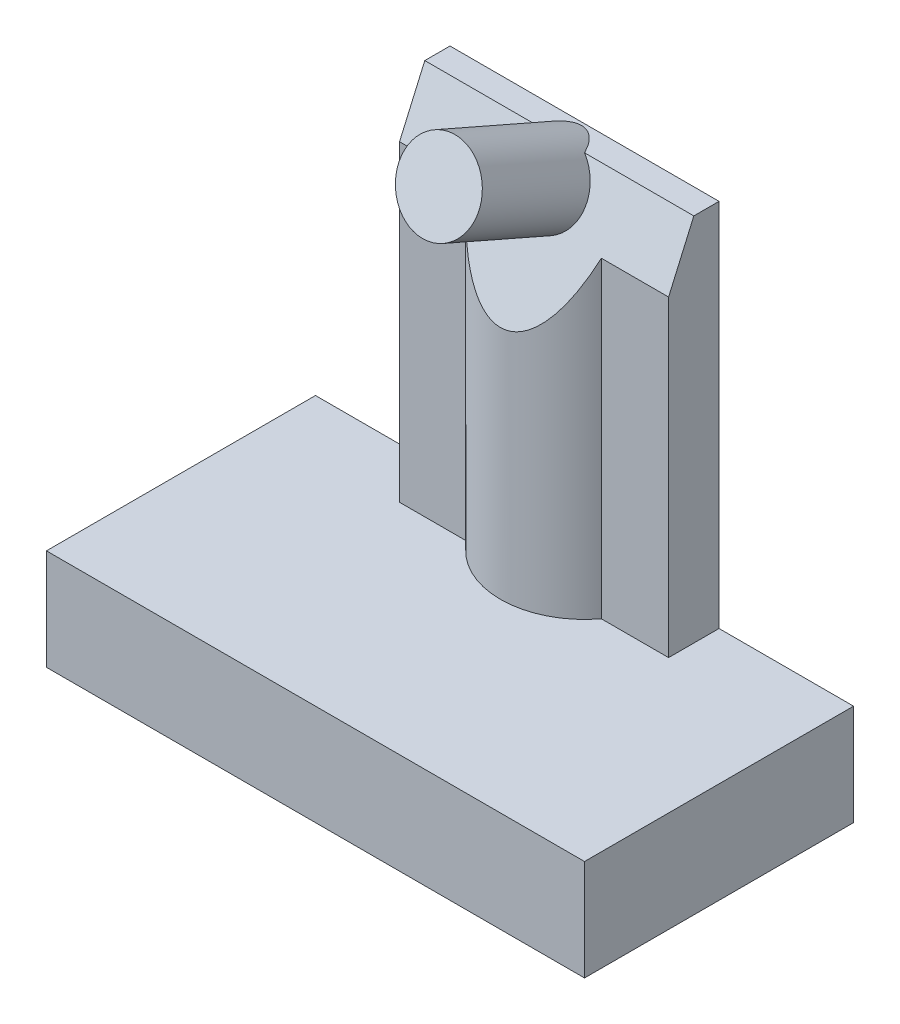
ISO-10303-21;
HEADER;
FILE_DESCRIPTION(('STEP AP214'),'2;1');
FILE_NAME('part.step','',(''),(''),'','','');
FILE_SCHEMA(('AUTOMOTIVE_DESIGN { 1 0 10303 214 1 1 1 1 }'));
ENDSEC;
DATA;
#1=APPLICATION_CONTEXT('core data for automotive mechanical design processes');
#2=APPLICATION_PROTOCOL_DEFINITION('international standard','automotive_design',2000,#1);
#3=PRODUCT_CONTEXT('',#1,'mechanical');
#4=PRODUCT('Part','Part','',(#3));
#5=PRODUCT_RELATED_PRODUCT_CATEGORY('part','',(#4));
#6=PRODUCT_DEFINITION_FORMATION('','',#4);
#7=PRODUCT_DEFINITION_CONTEXT('part definition',#1,'design');
#8=PRODUCT_DEFINITION('design','',#6,#7);
#9=PRODUCT_DEFINITION_SHAPE('','',#8);
#10=(LENGTH_UNIT() NAMED_UNIT(*) SI_UNIT(.MILLI.,.METRE.));
#11=(NAMED_UNIT(*) PLANE_ANGLE_UNIT() SI_UNIT($,.RADIAN.));
#12=(NAMED_UNIT(*) SI_UNIT($,.STERADIAN.) SOLID_ANGLE_UNIT());
#13=UNCERTAINTY_MEASURE_WITH_UNIT(LENGTH_MEASURE(1.E-05),#10,'distance_accuracy_value','');
#14=(GEOMETRIC_REPRESENTATION_CONTEXT(3) GLOBAL_UNCERTAINTY_ASSIGNED_CONTEXT((#13)) GLOBAL_UNIT_ASSIGNED_CONTEXT((#10,
#11,#12)) REPRESENTATION_CONTEXT('',''));
#15=CARTESIAN_POINT('',(0.,0.,0.));
#16=DIRECTION('',(0.,0.,1.));
#17=DIRECTION('',(1.,0.,0.));
#18=AXIS2_PLACEMENT_3D('',#15,#16,#17);
#19=CARTESIAN_POINT('',(-8.,10.,-1.5));
#20=DIRECTION('',(0.,-0.400818834019708,-0.916157334902189));
#21=DIRECTION('',(0.,0.916157334902189,-0.400818834019708));
#22=AXIS2_PLACEMENT_3D('',#19,#20,#21);
#23=PLANE('',#22);
#24=CARTESIAN_POINT('',(0.,13.1428571428571,-2.875));
#25=DIRECTION('',(0.,0.400818834019708,0.916157334902189));
#26=DIRECTION('',(0.,-0.916157334902189,0.400818834019708));
#27=AXIS2_PLACEMENT_3D('',#24,#25,#26);
#28=CIRCLE('',#27,1.2);
#29=CARTESIAN_POINT('',(-0.751452674789958,14.,-3.25));
#30=VERTEX_POINT('',#29);
#31=CARTESIAN_POINT('',(0.751452674789959,14.,-3.25));
#32=VERTEX_POINT('',#31);
#33=EDGE_CURVE('E54',#30,#32,#28,.T.);
#34=ORIENTED_EDGE('',*,*,#33,.F.);
#35=DIRECTION('',(-1.,0.,0.));
#36=VECTOR('',#35,1.);
#37=CARTESIAN_POINT('',(0.,14.,-3.25));
#38=LINE('',#37,#36);
#39=CARTESIAN_POINT('',(-4.,14.,-3.25));
#40=VERTEX_POINT('',#39);
#41=EDGE_CURVE('E48',#30,#40,#38,.T.);
#42=ORIENTED_EDGE('',*,*,#41,.T.);
#43=DIRECTION('',(0.,0.916157334902189,-0.400818834019708));
#44=VECTOR('',#43,1.);
#45=CARTESIAN_POINT('',(-4.,14.2754098360656,-3.37049180327869));
#46=LINE('',#45,#44);
#47=CARTESIAN_POINT('',(-4.,12.2857142857143,-2.50000000000001));
#48=VERTEX_POINT('',#47);
#49=EDGE_CURVE('E172',#48,#40,#46,.T.);
#50=ORIENTED_EDGE('',*,*,#49,.F.);
#51=DIRECTION('',(-1.,0.,0.));
#52=VECTOR('',#51,1.);
#53=CARTESIAN_POINT('',(-4.,12.2857142857143,-2.50000000000001));
#54=LINE('',#53,#52);
#55=CARTESIAN_POINT('',(-2.,12.2857142857143,-2.5));
#56=VERTEX_POINT('',#55);
#57=EDGE_CURVE('E168',#56,#48,#54,.T.);
#58=ORIENTED_EDGE('',*,*,#57,.F.);
#59=CARTESIAN_POINT('',(0.,15.7142857142857,-4.));
#60=DIRECTION('',(0.,-0.400818834019708,-0.916157334902189));
#61=DIRECTION('',(0.,-0.916157334902189,0.400818834019708));
#62=AXIS2_PLACEMENT_3D('',#59,#60,#61);
#63=ELLIPSE('',#62,6.23723185591891,2.5);
#64=CARTESIAN_POINT('',(2.,12.2857142857143,-2.5));
#65=VERTEX_POINT('',#64);
#66=EDGE_CURVE('E176',#65,#56,#63,.T.);
#67=ORIENTED_EDGE('',*,*,#66,.F.);
#68=DIRECTION('',(-1.,0.,0.));
#69=VECTOR('',#68,1.);
#70=CARTESIAN_POINT('',(4.,12.2857142857143,-2.5));
#71=LINE('',#70,#69);
#72=CARTESIAN_POINT('',(4.,12.2857142857143,-2.5));
#73=VERTEX_POINT('',#72);
#74=EDGE_CURVE('E179',#73,#65,#71,.T.);
#75=ORIENTED_EDGE('',*,*,#74,.F.);
#76=DIRECTION('',(0.,0.916157334902189,-0.400818834019708));
#77=VECTOR('',#76,1.);
#78=CARTESIAN_POINT('',(4.,10.,-1.5));
#79=LINE('',#78,#77);
#80=CARTESIAN_POINT('',(4.,14.,-3.25));
#81=VERTEX_POINT('',#80);
#82=EDGE_CURVE('E60',#73,#81,#79,.T.);
#83=ORIENTED_EDGE('',*,*,#82,.T.);
#84=EDGE_CURVE('E11',#81,#32,#38,.T.);
#85=ORIENTED_EDGE('',*,*,#84,.T.);
#86=EDGE_LOOP('',(#34,#42,#50,#58,#67,#75,#83,#85));
#87=FACE_BOUND('',#86,.T.);
#88=ADVANCED_FACE('F39',(#87),#23,.F.);
#89=CARTESIAN_POINT('',(8.,3.,-4.));
#90=DIRECTION('',(-1.,0.,0.));
#91=DIRECTION('',(0.,0.,1.));
#92=AXIS2_PLACEMENT_3D('',#89,#90,#91);
#93=PLANE('',#92);
#94=DIRECTION('',(0.,0.,-1.));
#95=VECTOR('',#94,1.);
#96=CARTESIAN_POINT('',(8.,0.,-4.));
#97=LINE('',#96,#95);
#98=CARTESIAN_POINT('',(8.00000000000001,0.,4.));
#99=VERTEX_POINT('',#98);
#100=CARTESIAN_POINT('',(8.,0.,-4.));
#101=VERTEX_POINT('',#100);
#102=EDGE_CURVE('E249',#99,#101,#97,.T.);
#103=ORIENTED_EDGE('',*,*,#102,.T.);
#104=DIRECTION('',(0.,-1.,0.));
#105=VECTOR('',#104,1.);
#106=CARTESIAN_POINT('',(8.,3.,-4.));
#107=LINE('',#106,#105);
#108=CARTESIAN_POINT('',(8.,3.,-4.));
#109=VERTEX_POINT('',#108);
#110=EDGE_CURVE('E326',#109,#101,#107,.T.);
#111=ORIENTED_EDGE('',*,*,#110,.F.);
#112=DIRECTION('',(0.,0.,-1.));
#113=VECTOR('',#112,1.);
#114=CARTESIAN_POINT('',(8.,3.,-4.));
#115=LINE('',#114,#113);
#116=CARTESIAN_POINT('',(8.00000000000001,3.,4.));
#117=VERTEX_POINT('',#116);
#118=EDGE_CURVE('E288',#117,#109,#115,.T.);
#119=ORIENTED_EDGE('',*,*,#118,.F.);
#120=DIRECTION('',(0.,-1.,0.));
#121=VECTOR('',#120,1.);
#122=CARTESIAN_POINT('',(8.00000000000001,3.,4.));
#123=LINE('',#122,#121);
#124=EDGE_CURVE('E303',#117,#99,#123,.T.);
#125=ORIENTED_EDGE('',*,*,#124,.T.);
#126=EDGE_LOOP('',(#103,#111,#119,#125));
#127=FACE_BOUND('',#126,.T.);
#128=ADVANCED_FACE('F41',(#127),#93,.F.);
#129=CARTESIAN_POINT('',(-8.,3.,-4.));
#130=DIRECTION('',(0.,0.,1.));
#131=DIRECTION('',(1.,0.,0.));
#132=AXIS2_PLACEMENT_3D('',#129,#130,#131);
#133=PLANE('',#132);
#134=DIRECTION('',(-1.,0.,0.));
#135=VECTOR('',#134,1.);
#136=CARTESIAN_POINT('',(-8.,0.,-4.));
#137=LINE('',#136,#135);
#138=CARTESIAN_POINT('',(-8.,0.,-4.));
#139=VERTEX_POINT('',#138);
#140=EDGE_CURVE('E307',#101,#139,#137,.T.);
#141=ORIENTED_EDGE('',*,*,#140,.T.);
#142=DIRECTION('',(0.,-1.,0.));
#143=VECTOR('',#142,1.);
#144=CARTESIAN_POINT('',(-8.,3.,-4.));
#145=LINE('',#144,#143);
#146=CARTESIAN_POINT('',(-8.,3.,-4.));
#147=VERTEX_POINT('',#146);
#148=EDGE_CURVE('E322',#147,#139,#145,.T.);
#149=ORIENTED_EDGE('',*,*,#148,.F.);
#150=DIRECTION('',(-1.,0.,0.));
#151=VECTOR('',#150,1.);
#152=CARTESIAN_POINT('',(-8.,3.,-4.));
#153=LINE('',#152,#151);
#154=CARTESIAN_POINT('',(-4.,3.,-4.));
#155=VERTEX_POINT('',#154);
#156=EDGE_CURVE('E292',#155,#147,#153,.T.);
#157=ORIENTED_EDGE('',*,*,#156,.F.);
#158=DIRECTION('',(0.,-1.,0.));
#159=VECTOR('',#158,1.);
#160=CARTESIAN_POINT('',(-4.,14.,-4.00000000000001));
#161=LINE('',#160,#159);
#162=CARTESIAN_POINT('',(-4.,14.,-4.00000000000001));
#163=VERTEX_POINT('',#162);
#164=EDGE_CURVE('E218',#163,#155,#161,.T.);
#165=ORIENTED_EDGE('',*,*,#164,.F.);
#166=DIRECTION('',(-1.,0.,0.));
#167=VECTOR('',#166,1.);
#168=CARTESIAN_POINT('',(-4.,14.,-4.00000000000001));
#169=LINE('',#168,#167);
#170=CARTESIAN_POINT('',(4.,14.,-4.));
#171=VERTEX_POINT('',#170);
#172=EDGE_CURVE('E187',#171,#163,#169,.T.);
#173=ORIENTED_EDGE('',*,*,#172,.F.);
#174=DIRECTION('',(0.,-1.,0.));
#175=VECTOR('',#174,1.);
#176=CARTESIAN_POINT('',(4.,14.,-4.));
#177=LINE('',#176,#175);
#178=CARTESIAN_POINT('',(4.,3.,-4.));
#179=VERTEX_POINT('',#178);
#180=EDGE_CURVE('E222',#171,#179,#177,.T.);
#181=ORIENTED_EDGE('',*,*,#180,.T.);
#182=EDGE_CURVE('E294',#109,#179,#153,.T.);
#183=ORIENTED_EDGE('',*,*,#182,.F.);
#184=ORIENTED_EDGE('',*,*,#110,.T.);
#185=EDGE_LOOP('',(#141,#149,#157,#165,#173,#181,#183,#184));
#186=FACE_BOUND('',#185,.T.);
#187=ADVANCED_FACE('F345',(#186),#133,.F.);
#188=CARTESIAN_POINT('',(-8.,3.,-4.));
#189=DIRECTION('',(1.,0.,0.));
#190=DIRECTION('',(0.,0.,-1.));
#191=AXIS2_PLACEMENT_3D('',#188,#189,#190);
#192=PLANE('',#191);
#193=DIRECTION('',(0.,0.,1.));
#194=VECTOR('',#193,1.);
#195=CARTESIAN_POINT('',(-8.,0.,-4.));
#196=LINE('',#195,#194);
#197=CARTESIAN_POINT('',(-8.,0.,4.));
#198=VERTEX_POINT('',#197);
#199=EDGE_CURVE('E310',#139,#198,#196,.T.);
#200=ORIENTED_EDGE('',*,*,#199,.T.);
#201=DIRECTION('',(0.,-1.,0.));
#202=VECTOR('',#201,1.);
#203=CARTESIAN_POINT('',(-8.,3.,4.));
#204=LINE('',#203,#202);
#205=CARTESIAN_POINT('',(-8.,3.,4.));
#206=VERTEX_POINT('',#205);
#207=EDGE_CURVE('E318',#206,#198,#204,.T.);
#208=ORIENTED_EDGE('',*,*,#207,.F.);
#209=DIRECTION('',(0.,0.,1.));
#210=VECTOR('',#209,1.);
#211=CARTESIAN_POINT('',(-8.,3.,-4.));
#212=LINE('',#211,#210);
#213=EDGE_CURVE('E297',#147,#206,#212,.T.);
#214=ORIENTED_EDGE('',*,*,#213,.F.);
#215=ORIENTED_EDGE('',*,*,#148,.T.);
#216=EDGE_LOOP('',(#200,#208,#214,#215));
#217=FACE_BOUND('',#216,.T.);
#218=ADVANCED_FACE('F406',(#217),#192,.F.);
#219=CARTESIAN_POINT('',(-8.,3.,4.));
#220=DIRECTION('',(0.,0.,-1.));
#221=DIRECTION('',(-1.,0.,0.));
#222=AXIS2_PLACEMENT_3D('',#219,#220,#221);
#223=PLANE('',#222);
#224=DIRECTION('',(1.,0.,0.));
#225=VECTOR('',#224,1.);
#226=CARTESIAN_POINT('',(-8.,0.,4.));
#227=LINE('',#226,#225);
#228=EDGE_CURVE('E293',#198,#99,#227,.T.);
#229=ORIENTED_EDGE('',*,*,#228,.T.);
#230=ORIENTED_EDGE('',*,*,#124,.F.);
#231=DIRECTION('',(1.,0.,0.));
#232=VECTOR('',#231,1.);
#233=CARTESIAN_POINT('',(-8.,3.,4.));
#234=LINE('',#233,#232);
#235=EDGE_CURVE('E300',#206,#117,#234,.T.);
#236=ORIENTED_EDGE('',*,*,#235,.F.);
#237=ORIENTED_EDGE('',*,*,#207,.T.);
#238=EDGE_LOOP('',(#229,#230,#236,#237));
#239=FACE_BOUND('',#238,.T.);
#240=ADVANCED_FACE('F409',(#239),#223,.F.);
#241=CARTESIAN_POINT('',(0.,3.,0.));
#242=DIRECTION('',(0.,1.,0.));
#243=DIRECTION('',(0.,0.,1.));
#244=AXIS2_PLACEMENT_3D('',#241,#242,#243);
#245=PLANE('',#244);
#246=DIRECTION('',(0.,0.,1.));
#247=VECTOR('',#246,1.);
#248=CARTESIAN_POINT('',(-4.,3.,-4.00000000000001));
#249=LINE('',#248,#247);
#250=CARTESIAN_POINT('',(-4.,3.,-2.50000000000001));
#251=VERTEX_POINT('',#250);
#252=EDGE_CURVE('E206',#155,#251,#249,.T.);
#253=ORIENTED_EDGE('',*,*,#252,.F.);
#254=ORIENTED_EDGE('',*,*,#156,.T.);
#255=ORIENTED_EDGE('',*,*,#213,.T.);
#256=ORIENTED_EDGE('',*,*,#235,.T.);
#257=ORIENTED_EDGE('',*,*,#118,.T.);
#258=ORIENTED_EDGE('',*,*,#182,.T.);
#259=DIRECTION('',(0.,0.,-1.));
#260=VECTOR('',#259,1.);
#261=CARTESIAN_POINT('',(4.,3.,-4.));
#262=LINE('',#261,#260);
#263=CARTESIAN_POINT('',(4.,3.,-2.5));
#264=VERTEX_POINT('',#263);
#265=EDGE_CURVE('E202',#264,#179,#262,.T.);
#266=ORIENTED_EDGE('',*,*,#265,.F.);
#267=DIRECTION('',(1.,0.,0.));
#268=VECTOR('',#267,1.);
#269=CARTESIAN_POINT('',(4.,3.,-2.5));
#270=LINE('',#269,#268);
#271=CARTESIAN_POINT('',(2.,3.,-2.5));
#272=VERTEX_POINT('',#271);
#273=EDGE_CURVE('E198',#272,#264,#270,.T.);
#274=ORIENTED_EDGE('',*,*,#273,.F.);
#275=CARTESIAN_POINT('',(0.,3.,-4.));
#276=DIRECTION('',(0.,1.,0.));
#277=DIRECTION('',(0.,0.,1.));
#278=AXIS2_PLACEMENT_3D('',#275,#276,#277);
#279=CIRCLE('',#278,2.5);
#280=CARTESIAN_POINT('',(-2.,3.,-2.5));
#281=VERTEX_POINT('',#280);
#282=EDGE_CURVE('E183',#281,#272,#279,.T.);
#283=ORIENTED_EDGE('',*,*,#282,.F.);
#284=DIRECTION('',(1.,0.,0.));
#285=VECTOR('',#284,1.);
#286=CARTESIAN_POINT('',(-4.,3.,-2.50000000000001));
#287=LINE('',#286,#285);
#288=EDGE_CURVE('E188',#251,#281,#287,.T.);
#289=ORIENTED_EDGE('',*,*,#288,.F.);
#290=EDGE_LOOP('',(#253,#254,#255,#256,#257,#258,#266,#274,#283,#289));
#291=FACE_BOUND('',#290,.T.);
#292=ADVANCED_FACE('F349',(#291),#245,.T.);
#293=CARTESIAN_POINT('',(0.,0.,0.));
#294=DIRECTION('',(0.,1.,0.));
#295=DIRECTION('',(0.,0.,1.));
#296=AXIS2_PLACEMENT_3D('',#293,#294,#295);
#297=PLANE('',#296);
#298=DIRECTION('',(1.,0.,0.));
#299=VECTOR('',#298,1.);
#300=CARTESIAN_POINT('',(-8.,0.,3.));
#301=LINE('',#300,#299);
#302=CARTESIAN_POINT('',(-7.,0.,3.));
#303=VERTEX_POINT('',#302);
#304=CARTESIAN_POINT('',(7.,0.,3.));
#305=VERTEX_POINT('',#304);
#306=EDGE_CURVE('E256',#303,#305,#301,.T.);
#307=ORIENTED_EDGE('',*,*,#306,.T.);
#308=DIRECTION('',(0.,0.,-1.));
#309=VECTOR('',#308,1.);
#310=CARTESIAN_POINT('',(7.,0.,-4.));
#311=LINE('',#310,#309);
#312=CARTESIAN_POINT('',(7.,0.,-3.));
#313=VERTEX_POINT('',#312);
#314=EDGE_CURVE('E244',#305,#313,#311,.T.);
#315=ORIENTED_EDGE('',*,*,#314,.T.);
#316=DIRECTION('',(-1.,0.,0.));
#317=VECTOR('',#316,1.);
#318=CARTESIAN_POINT('',(-8.,0.,-3.));
#319=LINE('',#318,#317);
#320=CARTESIAN_POINT('',(-7.,0.,-3.));
#321=VERTEX_POINT('',#320);
#322=EDGE_CURVE('E277',#313,#321,#319,.T.);
#323=ORIENTED_EDGE('',*,*,#322,.T.);
#324=DIRECTION('',(0.,0.,1.));
#325=VECTOR('',#324,1.);
#326=CARTESIAN_POINT('',(-7.,0.,-4.));
#327=LINE('',#326,#325);
#328=EDGE_CURVE('E281',#321,#303,#327,.T.);
#329=ORIENTED_EDGE('',*,*,#328,.T.);
#330=EDGE_LOOP('',(#307,#315,#323,#329));
#331=FACE_BOUND('',#330,.T.);
#332=ORIENTED_EDGE('',*,*,#102,.F.);
#333=ORIENTED_EDGE('',*,*,#228,.F.);
#334=ORIENTED_EDGE('',*,*,#199,.F.);
#335=ORIENTED_EDGE('',*,*,#140,.F.);
#336=EDGE_LOOP('',(#332,#333,#334,#335));
#337=FACE_BOUND('',#336,.T.);
#338=ADVANCED_FACE('F402',(#331,#337),#297,.F.);
#339=CARTESIAN_POINT('',(7.,3.,-4.));
#340=DIRECTION('',(-1.,0.,0.));
#341=DIRECTION('',(0.,0.,1.));
#342=AXIS2_PLACEMENT_3D('',#339,#340,#341);
#343=PLANE('',#342);
#344=ORIENTED_EDGE('',*,*,#314,.F.);
#345=DIRECTION('',(0.,-1.,0.));
#346=VECTOR('',#345,1.);
#347=CARTESIAN_POINT('',(7.,3.,3.));
#348=LINE('',#347,#346);
#349=CARTESIAN_POINT('',(7.,2.,3.));
#350=VERTEX_POINT('',#349);
#351=EDGE_CURVE('E257',#350,#305,#348,.T.);
#352=ORIENTED_EDGE('',*,*,#351,.F.);
#353=DIRECTION('',(0.,0.,-1.));
#354=VECTOR('',#353,1.);
#355=CARTESIAN_POINT('',(7.,2.,-4.));
#356=LINE('',#355,#354);
#357=CARTESIAN_POINT('',(7.,2.,-3.));
#358=VERTEX_POINT('',#357);
#359=EDGE_CURVE('E251',#350,#358,#356,.T.);
#360=ORIENTED_EDGE('',*,*,#359,.T.);
#361=DIRECTION('',(0.,-1.,0.));
#362=VECTOR('',#361,1.);
#363=CARTESIAN_POINT('',(7.,3.,-3.));
#364=LINE('',#363,#362);
#365=EDGE_CURVE('E245',#358,#313,#364,.T.);
#366=ORIENTED_EDGE('',*,*,#365,.T.);
#367=EDGE_LOOP('',(#344,#352,#360,#366));
#368=FACE_BOUND('',#367,.T.);
#369=ADVANCED_FACE('F447',(#368),#343,.T.);
#370=CARTESIAN_POINT('',(-8.,3.,-3.));
#371=DIRECTION('',(0.,0.,1.));
#372=DIRECTION('',(1.,0.,0.));
#373=AXIS2_PLACEMENT_3D('',#370,#371,#372);
#374=PLANE('',#373);
#375=ORIENTED_EDGE('',*,*,#322,.F.);
#376=ORIENTED_EDGE('',*,*,#365,.F.);
#377=DIRECTION('',(-1.,0.,0.));
#378=VECTOR('',#377,1.);
#379=CARTESIAN_POINT('',(-8.,2.,-3.));
#380=LINE('',#379,#378);
#381=CARTESIAN_POINT('',(-7.,2.,-3.));
#382=VERTEX_POINT('',#381);
#383=EDGE_CURVE('E255',#358,#382,#380,.T.);
#384=ORIENTED_EDGE('',*,*,#383,.T.);
#385=DIRECTION('',(0.,-1.,0.));
#386=VECTOR('',#385,1.);
#387=CARTESIAN_POINT('',(-7.,3.,-3.));
#388=LINE('',#387,#386);
#389=EDGE_CURVE('E250',#382,#321,#388,.T.);
#390=ORIENTED_EDGE('',*,*,#389,.T.);
#391=EDGE_LOOP('',(#375,#376,#384,#390));
#392=FACE_BOUND('',#391,.T.);
#393=ADVANCED_FACE('F456',(#392),#374,.T.);
#394=CARTESIAN_POINT('',(-7.,3.,-4.));
#395=DIRECTION('',(1.,0.,0.));
#396=DIRECTION('',(0.,0.,-1.));
#397=AXIS2_PLACEMENT_3D('',#394,#395,#396);
#398=PLANE('',#397);
#399=ORIENTED_EDGE('',*,*,#328,.F.);
#400=ORIENTED_EDGE('',*,*,#389,.F.);
#401=DIRECTION('',(0.,0.,1.));
#402=VECTOR('',#401,1.);
#403=CARTESIAN_POINT('',(-7.,2.,-4.));
#404=LINE('',#403,#402);
#405=CARTESIAN_POINT('',(-7.,2.,3.));
#406=VERTEX_POINT('',#405);
#407=EDGE_CURVE('E267',#382,#406,#404,.T.);
#408=ORIENTED_EDGE('',*,*,#407,.T.);
#409=DIRECTION('',(0.,-1.,0.));
#410=VECTOR('',#409,1.);
#411=CARTESIAN_POINT('',(-7.,3.,3.));
#412=LINE('',#411,#410);
#413=EDGE_CURVE('E260',#406,#303,#412,.T.);
#414=ORIENTED_EDGE('',*,*,#413,.T.);
#415=EDGE_LOOP('',(#399,#400,#408,#414));
#416=FACE_BOUND('',#415,.T.);
#417=ADVANCED_FACE('F466',(#416),#398,.T.);
#418=CARTESIAN_POINT('',(-8.,3.,3.));
#419=DIRECTION('',(0.,0.,-1.));
#420=DIRECTION('',(-1.,0.,0.));
#421=AXIS2_PLACEMENT_3D('',#418,#419,#420);
#422=PLANE('',#421);
#423=ORIENTED_EDGE('',*,*,#306,.F.);
#424=ORIENTED_EDGE('',*,*,#413,.F.);
#425=DIRECTION('',(1.,0.,0.));
#426=VECTOR('',#425,1.);
#427=CARTESIAN_POINT('',(-8.,2.,3.));
#428=LINE('',#427,#426);
#429=EDGE_CURVE('E261',#406,#350,#428,.T.);
#430=ORIENTED_EDGE('',*,*,#429,.T.);
#431=ORIENTED_EDGE('',*,*,#351,.T.);
#432=EDGE_LOOP('',(#423,#424,#430,#431));
#433=FACE_BOUND('',#432,.T.);
#434=ADVANCED_FACE('F476',(#433),#422,.T.);
#435=CARTESIAN_POINT('',(0.,2.,0.));
#436=DIRECTION('',(0.,1.,0.));
#437=DIRECTION('',(0.,0.,1.));
#438=AXIS2_PLACEMENT_3D('',#435,#436,#437);
#439=PLANE('',#438);
#440=CARTESIAN_POINT('',(0.,2.,0.));
#441=DIRECTION('',(0.,1.,0.));
#442=DIRECTION('',(0.,0.,1.));
#443=AXIS2_PLACEMENT_3D('',#440,#441,#442);
#444=CIRCLE('',#443,1.5);
#445=CARTESIAN_POINT('',(0.,2.,1.5));
#446=VERTEX_POINT('',#445);
#447=EDGE_CURVE('E329',#446,#446,#444,.F.);
#448=ORIENTED_EDGE('',*,*,#447,.F.);
#449=EDGE_LOOP('',(#448));
#450=FACE_BOUND('',#449,.T.);
#451=ORIENTED_EDGE('',*,*,#359,.F.);
#452=ORIENTED_EDGE('',*,*,#429,.F.);
#453=ORIENTED_EDGE('',*,*,#407,.F.);
#454=ORIENTED_EDGE('',*,*,#383,.F.);
#455=EDGE_LOOP('',(#451,#452,#453,#454));
#456=FACE_BOUND('',#455,.T.);
#457=ADVANCED_FACE('F373',(#450,#456),#439,.F.);
#458=CARTESIAN_POINT('',(0.,0.,0.));
#459=DIRECTION('',(0.,-1.,0.));
#460=DIRECTION('',(0.,0.,-1.));
#461=AXIS2_PLACEMENT_3D('',#458,#459,#460);
#462=PLANE('',#461);
#463=CARTESIAN_POINT('',(0.,0.,0.));
#464=DIRECTION('',(0.,-1.,0.));
#465=DIRECTION('',(0.,0.,-1.));
#466=AXIS2_PLACEMENT_3D('',#463,#464,#465);
#467=CIRCLE('',#466,1.5);
#468=CARTESIAN_POINT('',(0.,0.,-1.5));
#469=VERTEX_POINT('',#468);
#470=EDGE_CURVE('E237',#469,#469,#467,.T.);
#471=ORIENTED_EDGE('',*,*,#470,.T.);
#472=EDGE_LOOP('',(#471));
#473=FACE_BOUND('',#472,.T.);
#474=CARTESIAN_POINT('',(0.,0.,0.));
#475=DIRECTION('',(0.,-1.,0.));
#476=DIRECTION('',(0.,0.,-1.));
#477=AXIS2_PLACEMENT_3D('',#474,#475,#476);
#478=CIRCLE('',#477,0.8);
#479=CARTESIAN_POINT('',(0.,0.,-0.8));
#480=VERTEX_POINT('',#479);
#481=EDGE_CURVE('E233',#480,#480,#478,.T.);
#482=ORIENTED_EDGE('',*,*,#481,.F.);
#483=EDGE_LOOP('',(#482));
#484=FACE_BOUND('',#483,.T.);
#485=ADVANCED_FACE('F495',(#473,#484),#462,.T.);
#486=CARTESIAN_POINT('',(0.,0.,0.));
#487=DIRECTION('',(0.,1.,0.));
#488=DIRECTION('',(0.,0.,1.));
#489=AXIS2_PLACEMENT_3D('',#486,#487,#488);
#490=CYLINDRICAL_SURFACE('',#489,1.5);
#491=ORIENTED_EDGE('',*,*,#470,.F.);
#492=EDGE_LOOP('',(#491));
#493=FACE_BOUND('',#492,.T.);
#494=ORIENTED_EDGE('',*,*,#447,.T.);
#495=EDGE_LOOP('',(#494));
#496=FACE_BOUND('',#495,.T.);
#497=ADVANCED_FACE('F505',(#493,#496),#490,.T.);
#498=CARTESIAN_POINT('',(0.,0.,0.));
#499=DIRECTION('',(0.,1.,0.));
#500=DIRECTION('',(0.,0.,1.));
#501=AXIS2_PLACEMENT_3D('',#498,#499,#500);
#502=CYLINDRICAL_SURFACE('',#501,0.8);
#503=ORIENTED_EDGE('',*,*,#481,.T.);
#504=EDGE_LOOP('',(#503));
#505=FACE_BOUND('',#504,.T.);
#506=CARTESIAN_POINT('',(0.,2.,0.));
#507=DIRECTION('',(0.,-1.,0.));
#508=DIRECTION('',(0.,0.,-1.));
#509=AXIS2_PLACEMENT_3D('',#506,#507,#508);
#510=CIRCLE('',#509,0.8);
#511=CARTESIAN_POINT('',(0.,2.,-0.8));
#512=VERTEX_POINT('',#511);
#513=EDGE_CURVE('E232',#512,#512,#510,.T.);
#514=ORIENTED_EDGE('',*,*,#513,.F.);
#515=EDGE_LOOP('',(#514));
#516=FACE_BOUND('',#515,.T.);
#517=ADVANCED_FACE('F370',(#505,#516),#502,.F.);
#518=ORIENTED_EDGE('',*,*,#513,.T.);
#519=EDGE_LOOP('',(#518));
#520=FACE_BOUND('',#519,.T.);
#521=ADVANCED_FACE('F362',(#520),#439,.F.);
#522=CARTESIAN_POINT('',(0.,14.,-4.));
#523=DIRECTION('',(0.,-1.,0.));
#524=DIRECTION('',(0.,0.,-1.));
#525=AXIS2_PLACEMENT_3D('',#522,#523,#524);
#526=CYLINDRICAL_SURFACE('',#525,2.5);
#527=ORIENTED_EDGE('',*,*,#66,.T.);
#528=DIRECTION('',(0.,-1.,0.));
#529=VECTOR('',#528,1.);
#530=CARTESIAN_POINT('',(-2.,14.,-2.5));
#531=LINE('',#530,#529);
#532=EDGE_CURVE('E194',#56,#281,#531,.T.);
#533=ORIENTED_EDGE('',*,*,#532,.T.);
#534=ORIENTED_EDGE('',*,*,#282,.T.);
#535=DIRECTION('',(0.,-1.,0.));
#536=VECTOR('',#535,1.);
#537=CARTESIAN_POINT('',(2.,14.,-2.5));
#538=LINE('',#537,#536);
#539=EDGE_CURVE('E229',#65,#272,#538,.T.);
#540=ORIENTED_EDGE('',*,*,#539,.F.);
#541=EDGE_LOOP('',(#527,#533,#534,#540));
#542=FACE_BOUND('',#541,.T.);
#543=ADVANCED_FACE('F360',(#542),#526,.T.);
#544=CARTESIAN_POINT('',(4.,14.,-2.5));
#545=DIRECTION('',(0.,0.,-1.));
#546=DIRECTION('',(-1.,0.,0.));
#547=AXIS2_PLACEMENT_3D('',#544,#545,#546);
#548=PLANE('',#547);
#549=DIRECTION('',(0.,-1.,0.));
#550=VECTOR('',#549,1.);
#551=CARTESIAN_POINT('',(4.,14.,-2.5));
#552=LINE('',#551,#550);
#553=EDGE_CURVE('E226',#73,#264,#552,.T.);
#554=ORIENTED_EDGE('',*,*,#553,.F.);
#555=ORIENTED_EDGE('',*,*,#74,.T.);
#556=ORIENTED_EDGE('',*,*,#539,.T.);
#557=ORIENTED_EDGE('',*,*,#273,.T.);
#558=EDGE_LOOP('',(#554,#555,#556,#557));
#559=FACE_BOUND('',#558,.T.);
#560=ADVANCED_FACE('F359',(#559),#548,.F.);
#561=CARTESIAN_POINT('',(4.,14.,-4.));
#562=DIRECTION('',(-1.,0.,0.));
#563=DIRECTION('',(0.,0.,1.));
#564=AXIS2_PLACEMENT_3D('',#561,#562,#563);
#565=PLANE('',#564);
#566=DIRECTION('',(0.,0.,-1.));
#567=VECTOR('',#566,1.);
#568=CARTESIAN_POINT('',(4.,14.,-4.));
#569=LINE('',#568,#567);
#570=EDGE_CURVE('E184',#81,#171,#569,.T.);
#571=ORIENTED_EDGE('',*,*,#570,.F.);
#572=ORIENTED_EDGE('',*,*,#82,.F.);
#573=ORIENTED_EDGE('',*,*,#553,.T.);
#574=ORIENTED_EDGE('',*,*,#265,.T.);
#575=ORIENTED_EDGE('',*,*,#180,.F.);
#576=EDGE_LOOP('',(#571,#572,#573,#574,#575));
#577=FACE_BOUND('',#576,.T.);
#578=ADVANCED_FACE('F368',(#577),#565,.F.);
#579=CARTESIAN_POINT('',(-4.,14.,-4.00000000000001));
#580=DIRECTION('',(1.,0.,0.));
#581=DIRECTION('',(0.,0.,-1.));
#582=AXIS2_PLACEMENT_3D('',#579,#580,#581);
#583=PLANE('',#582);
#584=DIRECTION('',(0.,-1.,0.));
#585=VECTOR('',#584,1.);
#586=CARTESIAN_POINT('',(-4.,14.,-2.50000000000001));
#587=LINE('',#586,#585);
#588=EDGE_CURVE('E215',#48,#251,#587,.T.);
#589=ORIENTED_EDGE('',*,*,#588,.F.);
#590=ORIENTED_EDGE('',*,*,#49,.T.);
#591=DIRECTION('',(0.,0.,1.));
#592=VECTOR('',#591,1.);
#593=CARTESIAN_POINT('',(-4.,14.,-4.00000000000001));
#594=LINE('',#593,#592);
#595=EDGE_CURVE('E191',#163,#40,#594,.T.);
#596=ORIENTED_EDGE('',*,*,#595,.F.);
#597=ORIENTED_EDGE('',*,*,#164,.T.);
#598=ORIENTED_EDGE('',*,*,#252,.T.);
#599=EDGE_LOOP('',(#589,#590,#596,#597,#598));
#600=FACE_BOUND('',#599,.T.);
#601=ADVANCED_FACE('F339',(#600),#583,.F.);
#602=CARTESIAN_POINT('',(-4.,14.,-2.50000000000001));
#603=DIRECTION('',(0.,0.,-1.));
#604=DIRECTION('',(-1.,0.,0.));
#605=AXIS2_PLACEMENT_3D('',#602,#603,#604);
#606=PLANE('',#605);
#607=ORIENTED_EDGE('',*,*,#532,.F.);
#608=ORIENTED_EDGE('',*,*,#57,.T.);
#609=ORIENTED_EDGE('',*,*,#588,.T.);
#610=ORIENTED_EDGE('',*,*,#288,.T.);
#611=EDGE_LOOP('',(#607,#608,#609,#610));
#612=FACE_BOUND('',#611,.T.);
#613=ADVANCED_FACE('F354',(#612),#606,.F.);
#614=CARTESIAN_POINT('',(0.,14.,-4.));
#615=DIRECTION('',(0.,1.,0.));
#616=DIRECTION('',(0.,0.,1.));
#617=AXIS2_PLACEMENT_3D('',#614,#615,#616);
#618=PLANE('',#617);
#619=ORIENTED_EDGE('',*,*,#41,.F.);
#620=CARTESIAN_POINT('',(0.,14.,-0.915816326530626));
#621=DIRECTION('',(0.,1.,0.));
#622=DIRECTION('',(0.,0.,1.));
#623=AXIS2_PLACEMENT_3D('',#620,#621,#622);
#624=ELLIPSE('',#623,2.99387129084108,1.2);
#625=EDGE_CURVE('E152',#30,#32,#624,.F.);
#626=ORIENTED_EDGE('',*,*,#625,.T.);
#627=ORIENTED_EDGE('',*,*,#84,.F.);
#628=ORIENTED_EDGE('',*,*,#570,.T.);
#629=ORIENTED_EDGE('',*,*,#172,.T.);
#630=ORIENTED_EDGE('',*,*,#595,.T.);
#631=EDGE_LOOP('',(#619,#626,#627,#628,#629,#630));
#632=FACE_BOUND('',#631,.T.);
#633=ADVANCED_FACE('F153',(#632),#618,.T.);
#634=CARTESIAN_POINT('',(0.,14.5457230619261,0.331550672157656));
#635=DIRECTION('',(0.,-0.400818834019708,-0.916157334902189));
#636=DIRECTION('',(0.,0.916157334902189,-0.400818834019708));
#637=AXIS2_PLACEMENT_3D('',#634,#635,#636);
#638=CYLINDRICAL_SURFACE('',#637,1.2);
#639=CARTESIAN_POINT('',(0.,14.5457230619261,0.331550672157656));
#640=DIRECTION('',(0.,0.400818834019708,0.916157334902189));
#641=DIRECTION('',(0.,-0.916157334902189,0.400818834019708));
#642=AXIS2_PLACEMENT_3D('',#639,#640,#641);
#643=CIRCLE('',#642,1.2);
#644=CARTESIAN_POINT('',(0.,13.4463342600435,0.812533272981306));
#645=VERTEX_POINT('',#644);
#646=EDGE_CURVE('E160',#645,#645,#643,.T.);
#647=ORIENTED_EDGE('',*,*,#646,.F.);
#648=EDGE_LOOP('',(#647));
#649=FACE_BOUND('',#648,.T.);
#650=ORIENTED_EDGE('',*,*,#33,.T.);
#651=ORIENTED_EDGE('',*,*,#625,.F.);
#652=EDGE_LOOP('',(#650,#651));
#653=FACE_BOUND('',#652,.T.);
#654=ADVANCED_FACE('F158',(#649,#653),#638,.T.);
#655=CARTESIAN_POINT('',(0.,14.5457230619261,0.331550672157656));
#656=DIRECTION('',(0.,0.400818834019708,0.916157334902189));
#657=DIRECTION('',(0.,-0.916157334902189,0.400818834019708));
#658=AXIS2_PLACEMENT_3D('',#655,#656,#657);
#659=PLANE('',#658);
#660=ORIENTED_EDGE('',*,*,#646,.T.);
#661=EDGE_LOOP('',(#660));
#662=FACE_BOUND('',#661,.T.);
#663=ADVANCED_FACE('F573',(#662),#659,.T.);
#664=CLOSED_SHELL('',(#88,#128,#187,#218,#240,#292,#338,#369,#393,#417,#434,#457,#485,#497,#517,
#521,#543,#560,#578,#601,#613,#633,#654,#663));
#665=MANIFOLD_SOLID_BREP('B2',#664);
#666=ADVANCED_BREP_SHAPE_REPRESENTATION('',(#18,#665),#14);
#667=SHAPE_DEFINITION_REPRESENTATION(#9,#666);
ENDSEC;
END-ISO-10303-21;
